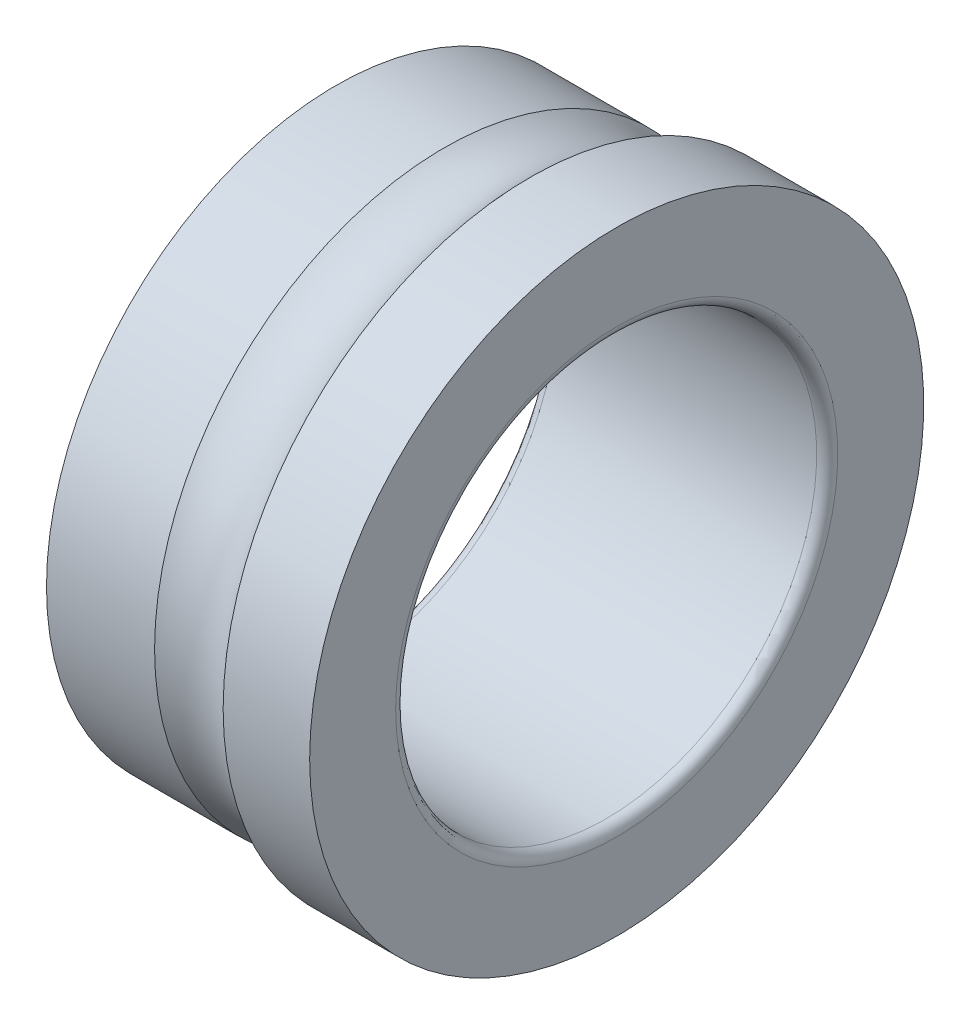
ISO-10303-21;
HEADER;
FILE_DESCRIPTION(('STEP AP214'),'2;1');
FILE_NAME('part.step','',(''),(''),'','','');
FILE_SCHEMA(('AUTOMOTIVE_DESIGN { 1 0 10303 214 1 1 1 1 }'));
ENDSEC;
DATA;
#1=APPLICATION_CONTEXT('core data for automotive mechanical design processes');
#2=APPLICATION_PROTOCOL_DEFINITION('international standard','automotive_design',2000,#1);
#3=PRODUCT_CONTEXT('',#1,'mechanical');
#4=PRODUCT('Part','Part','',(#3));
#5=PRODUCT_RELATED_PRODUCT_CATEGORY('part','',(#4));
#6=PRODUCT_DEFINITION_FORMATION('','',#4);
#7=PRODUCT_DEFINITION_CONTEXT('part definition',#1,'design');
#8=PRODUCT_DEFINITION('design','',#6,#7);
#9=PRODUCT_DEFINITION_SHAPE('','',#8);
#10=(LENGTH_UNIT() NAMED_UNIT(*) SI_UNIT(.MILLI.,.METRE.));
#11=(NAMED_UNIT(*) PLANE_ANGLE_UNIT() SI_UNIT($,.RADIAN.));
#12=(NAMED_UNIT(*) SI_UNIT($,.STERADIAN.) SOLID_ANGLE_UNIT());
#13=UNCERTAINTY_MEASURE_WITH_UNIT(LENGTH_MEASURE(1.E-05),#10,'distance_accuracy_value','');
#14=(GEOMETRIC_REPRESENTATION_CONTEXT(3) GLOBAL_UNCERTAINTY_ASSIGNED_CONTEXT((#13)) GLOBAL_UNIT_ASSIGNED_CONTEXT((#10,
#11,#12)) REPRESENTATION_CONTEXT('',''));
#15=CARTESIAN_POINT('',(0.,0.,0.));
#16=DIRECTION('',(0.,0.,1.));
#17=DIRECTION('',(1.,0.,0.));
#18=AXIS2_PLACEMENT_3D('',#15,#16,#17);
#19=CARTESIAN_POINT('',(-3.70000000000012,0.,0.));
#20=DIRECTION('',(-1.,0.,0.));
#21=DIRECTION('',(0.,0.,1.));
#22=AXIS2_PLACEMENT_3D('',#19,#20,#21);
#23=TOROIDAL_SURFACE('',#22,6.29999999999988,0.299999999999877);
#24=CARTESIAN_POINT('',(-3.7,0.,0.));
#25=DIRECTION('',(-1.,0.,0.));
#26=DIRECTION('',(0.,0.,1.));
#27=AXIS2_PLACEMENT_3D('',#24,#25,#26);
#28=CIRCLE('',#27,6.);
#29=CARTESIAN_POINT('',(-3.7,0.,6.));
#30=VERTEX_POINT('',#29);
#31=EDGE_CURVE('E10',#30,#30,#28,.T.);
#32=ORIENTED_EDGE('',*,*,#31,.F.);
#33=EDGE_LOOP('',(#32));
#34=FACE_BOUND('',#33,.T.);
#35=CARTESIAN_POINT('',(-4.,0.,0.));
#36=DIRECTION('',(-1.,0.,0.));
#37=DIRECTION('',(0.,0.,1.));
#38=AXIS2_PLACEMENT_3D('',#35,#36,#37);
#39=CIRCLE('',#38,6.3);
#40=CARTESIAN_POINT('',(-4.,0.,6.3));
#41=VERTEX_POINT('',#40);
#42=EDGE_CURVE('E64',#41,#41,#39,.T.);
#43=ORIENTED_EDGE('',*,*,#42,.T.);
#44=EDGE_LOOP('',(#43));
#45=FACE_BOUND('',#44,.T.);
#46=ADVANCED_FACE('F34',(#34,#45),#23,.T.);
#47=CARTESIAN_POINT('',(4.,0.,0.));
#48=DIRECTION('',(-1.,0.,0.));
#49=DIRECTION('',(0.,0.,1.));
#50=AXIS2_PLACEMENT_3D('',#47,#48,#49);
#51=CYLINDRICAL_SURFACE('',#50,6.);
#52=CARTESIAN_POINT('',(3.7,0.,0.));
#53=DIRECTION('',(-1.,0.,0.));
#54=DIRECTION('',(0.,0.,1.));
#55=AXIS2_PLACEMENT_3D('',#52,#53,#54);
#56=CIRCLE('',#55,6.);
#57=CARTESIAN_POINT('',(3.7,0.,6.));
#58=VERTEX_POINT('',#57);
#59=EDGE_CURVE('E41',#58,#58,#56,.T.);
#60=ORIENTED_EDGE('',*,*,#59,.F.);
#61=EDGE_LOOP('',(#60));
#62=FACE_BOUND('',#61,.T.);
#63=ORIENTED_EDGE('',*,*,#31,.T.);
#64=EDGE_LOOP('',(#63));
#65=FACE_BOUND('',#64,.T.);
#66=ADVANCED_FACE('F99',(#62,#65),#51,.F.);
#67=CARTESIAN_POINT('',(3.70000000000012,0.,0.));
#68=DIRECTION('',(-1.,0.,0.));
#69=DIRECTION('',(0.,0.,1.));
#70=AXIS2_PLACEMENT_3D('',#67,#68,#69);
#71=TOROIDAL_SURFACE('',#70,6.29999999999988,0.299999999999877);
#72=CARTESIAN_POINT('',(4.,0.,0.));
#73=DIRECTION('',(-1.,0.,0.));
#74=DIRECTION('',(0.,0.,1.));
#75=AXIS2_PLACEMENT_3D('',#72,#73,#74);
#76=CIRCLE('',#75,6.3);
#77=CARTESIAN_POINT('',(4.,0.,6.3));
#78=VERTEX_POINT('',#77);
#79=EDGE_CURVE('E44',#78,#78,#76,.T.);
#80=ORIENTED_EDGE('',*,*,#79,.F.);
#81=EDGE_LOOP('',(#80));
#82=FACE_BOUND('',#81,.T.);
#83=ORIENTED_EDGE('',*,*,#59,.T.);
#84=EDGE_LOOP('',(#83));
#85=FACE_BOUND('',#84,.T.);
#86=ADVANCED_FACE('F94',(#82,#85),#71,.T.);
#87=CARTESIAN_POINT('',(4.,6.3,0.));
#88=DIRECTION('',(-1.,0.,0.));
#89=DIRECTION('',(0.,0.,1.));
#90=AXIS2_PLACEMENT_3D('',#87,#88,#89);
#91=PLANE('',#90);
#92=CARTESIAN_POINT('',(4.,0.,0.));
#93=DIRECTION('',(-1.,0.,0.));
#94=DIRECTION('',(0.,0.,1.));
#95=AXIS2_PLACEMENT_3D('',#92,#93,#94);
#96=CIRCLE('',#95,8.75);
#97=CARTESIAN_POINT('',(4.,0.,8.75));
#98=VERTEX_POINT('',#97);
#99=EDGE_CURVE('E47',#98,#98,#96,.T.);
#100=ORIENTED_EDGE('',*,*,#99,.F.);
#101=EDGE_LOOP('',(#100));
#102=FACE_BOUND('',#101,.T.);
#103=ORIENTED_EDGE('',*,*,#79,.T.);
#104=EDGE_LOOP('',(#103));
#105=FACE_BOUND('',#104,.T.);
#106=ADVANCED_FACE('F89',(#102,#105),#91,.F.);
#107=CARTESIAN_POINT('',(4.,0.,0.));
#108=DIRECTION('',(-1.,0.,0.));
#109=DIRECTION('',(0.,0.,1.));
#110=AXIS2_PLACEMENT_3D('',#107,#108,#109);
#111=CYLINDRICAL_SURFACE('',#110,8.75);
#112=CARTESIAN_POINT('',(1.5344112877583,0.,0.));
#113=DIRECTION('',(-1.,0.,0.));
#114=DIRECTION('',(0.,0.,1.));
#115=AXIS2_PLACEMENT_3D('',#112,#113,#114);
#116=CIRCLE('',#115,8.75);
#117=CARTESIAN_POINT('',(1.5344112877583,0.,8.75));
#118=VERTEX_POINT('',#117);
#119=EDGE_CURVE('E53',#118,#118,#116,.T.);
#120=ORIENTED_EDGE('',*,*,#119,.F.);
#121=EDGE_LOOP('',(#120));
#122=FACE_BOUND('',#121,.T.);
#123=ORIENTED_EDGE('',*,*,#99,.T.);
#124=EDGE_LOOP('',(#123));
#125=FACE_BOUND('',#124,.T.);
#126=ADVANCED_FACE('F81',(#122,#125),#111,.T.);
#127=CARTESIAN_POINT('',(0.,0.,0.));
#128=DIRECTION('',(-1.,0.,0.));
#129=DIRECTION('',(0.,0.,1.));
#130=AXIS2_PLACEMENT_3D('',#127,#128,#129);
#131=TOROIDAL_SURFACE('',#130,10.0085000000002,1.98450000000017);
#132=CARTESIAN_POINT('',(-0.9197380061735,0.,0.));
#133=DIRECTION('',(-1.,0.,0.));
#134=DIRECTION('',(0.,0.,1.));
#135=AXIS2_PLACEMENT_3D('',#132,#133,#134);
#136=CIRCLE('',#135,8.25);
#137=CARTESIAN_POINT('',(-0.9197380061735,0.,8.25));
#138=VERTEX_POINT('',#137);
#139=EDGE_CURVE('E60',#138,#138,#136,.T.);
#140=ORIENTED_EDGE('',*,*,#139,.F.);
#141=EDGE_LOOP('',(#140));
#142=FACE_BOUND('',#141,.T.);
#143=ORIENTED_EDGE('',*,*,#119,.T.);
#144=EDGE_LOOP('',(#143));
#145=FACE_BOUND('',#144,.T.);
#146=ADVANCED_FACE('F80',(#142,#145),#131,.F.);
#147=CARTESIAN_POINT('',(4.,0.,0.));
#148=DIRECTION('',(-1.,0.,0.));
#149=DIRECTION('',(0.,0.,1.));
#150=AXIS2_PLACEMENT_3D('',#147,#148,#149);
#151=CYLINDRICAL_SURFACE('',#150,8.25);
#152=CARTESIAN_POINT('',(-4.,0.,0.));
#153=DIRECTION('',(-1.,0.,0.));
#154=DIRECTION('',(0.,0.,1.));
#155=AXIS2_PLACEMENT_3D('',#152,#153,#154);
#156=CIRCLE('',#155,8.25);
#157=CARTESIAN_POINT('',(-4.,0.,8.25));
#158=VERTEX_POINT('',#157);
#159=EDGE_CURVE('E58',#158,#158,#156,.T.);
#160=ORIENTED_EDGE('',*,*,#159,.F.);
#161=EDGE_LOOP('',(#160));
#162=FACE_BOUND('',#161,.T.);
#163=ORIENTED_EDGE('',*,*,#139,.T.);
#164=EDGE_LOOP('',(#163));
#165=FACE_BOUND('',#164,.T.);
#166=ADVANCED_FACE('F72',(#162,#165),#151,.T.);
#167=CARTESIAN_POINT('',(-4.,8.25,0.));
#168=DIRECTION('',(1.,0.,0.));
#169=DIRECTION('',(0.,0.,-1.));
#170=AXIS2_PLACEMENT_3D('',#167,#168,#169);
#171=PLANE('',#170);
#172=ORIENTED_EDGE('',*,*,#42,.F.);
#173=EDGE_LOOP('',(#172));
#174=FACE_BOUND('',#173,.T.);
#175=ORIENTED_EDGE('',*,*,#159,.T.);
#176=EDGE_LOOP('',(#175));
#177=FACE_BOUND('',#176,.T.);
#178=ADVANCED_FACE('F69',(#174,#177),#171,.F.);
#179=CLOSED_SHELL('',(#46,#66,#86,#106,#126,#146,#166,#178));
#180=MANIFOLD_SOLID_BREP('B2',#179);
#181=ADVANCED_BREP_SHAPE_REPRESENTATION('',(#18,#180),#14);
#182=SHAPE_DEFINITION_REPRESENTATION(#9,#181);
ENDSEC;
END-ISO-10303-21;
